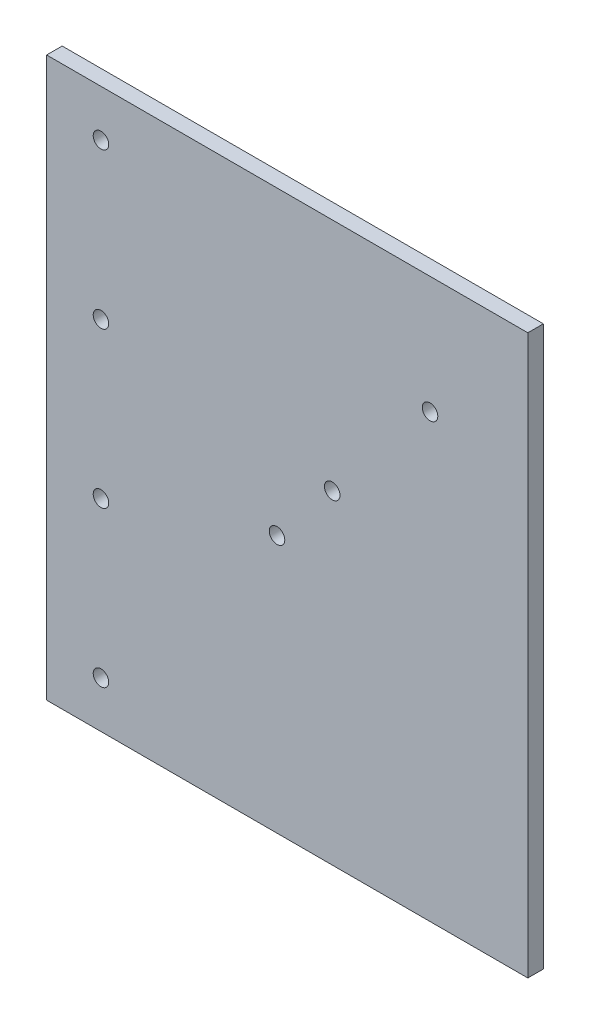
ISO-10303-21;
HEADER;
FILE_DESCRIPTION(('STEP AP214'),'2;1');
FILE_NAME('part.step','',(''),(''),'','','');
FILE_SCHEMA(('AUTOMOTIVE_DESIGN { 1 0 10303 214 1 1 1 1 }'));
ENDSEC;
DATA;
#1=APPLICATION_CONTEXT('core data for automotive mechanical design processes');
#2=APPLICATION_PROTOCOL_DEFINITION('international standard','automotive_design',2000,#1);
#3=PRODUCT_CONTEXT('',#1,'mechanical');
#4=PRODUCT('Part','Part','',(#3));
#5=PRODUCT_RELATED_PRODUCT_CATEGORY('part','',(#4));
#6=PRODUCT_DEFINITION_FORMATION('','',#4);
#7=PRODUCT_DEFINITION_CONTEXT('part definition',#1,'design');
#8=PRODUCT_DEFINITION('design','',#6,#7);
#9=PRODUCT_DEFINITION_SHAPE('','',#8);
#10=(LENGTH_UNIT() NAMED_UNIT(*) SI_UNIT(.MILLI.,.METRE.));
#11=(NAMED_UNIT(*) PLANE_ANGLE_UNIT() SI_UNIT($,.RADIAN.));
#12=(NAMED_UNIT(*) SI_UNIT($,.STERADIAN.) SOLID_ANGLE_UNIT());
#13=UNCERTAINTY_MEASURE_WITH_UNIT(LENGTH_MEASURE(1.E-05),#10,'distance_accuracy_value','');
#14=(GEOMETRIC_REPRESENTATION_CONTEXT(3) GLOBAL_UNCERTAINTY_ASSIGNED_CONTEXT((#13)) GLOBAL_UNIT_ASSIGNED_CONTEXT((#10,
#11,#12)) REPRESENTATION_CONTEXT('',''));
#15=CARTESIAN_POINT('',(0.,0.,0.));
#16=DIRECTION('',(0.,0.,1.));
#17=DIRECTION('',(1.,0.,0.));
#18=AXIS2_PLACEMENT_3D('',#15,#16,#17);
#19=CARTESIAN_POINT('',(0.,0.,12.7));
#20=DIRECTION('',(1.,0.,0.));
#21=DIRECTION('',(0.,0.,-1.));
#22=AXIS2_PLACEMENT_3D('',#19,#20,#21);
#23=PLANE('',#22);
#24=DIRECTION('',(0.,-1.,0.));
#25=VECTOR('',#24,1.);
#26=CARTESIAN_POINT('',(0.,0.,0.));
#27=LINE('',#26,#25);
#28=CARTESIAN_POINT('',(0.,457.2,0.));
#29=VERTEX_POINT('',#28);
#30=CARTESIAN_POINT('',(0.,0.,0.));
#31=VERTEX_POINT('',#30);
#32=EDGE_CURVE('E117',#29,#31,#27,.T.);
#33=ORIENTED_EDGE('',*,*,#32,.T.);
#34=DIRECTION('',(0.,0.,-1.));
#35=VECTOR('',#34,1.);
#36=CARTESIAN_POINT('',(0.,0.,12.7));
#37=LINE('',#36,#35);
#38=CARTESIAN_POINT('',(0.,0.,12.7));
#39=VERTEX_POINT('',#38);
#40=EDGE_CURVE('E106',#39,#31,#37,.T.);
#41=ORIENTED_EDGE('',*,*,#40,.F.);
#42=DIRECTION('',(0.,-1.,0.));
#43=VECTOR('',#42,1.);
#44=CARTESIAN_POINT('',(0.,0.,12.7));
#45=LINE('',#44,#43);
#46=CARTESIAN_POINT('',(0.,457.2,12.7));
#47=VERTEX_POINT('',#46);
#48=EDGE_CURVE('E98',#47,#39,#45,.T.);
#49=ORIENTED_EDGE('',*,*,#48,.F.);
#50=DIRECTION('',(0.,0.,-1.));
#51=VECTOR('',#50,1.);
#52=CARTESIAN_POINT('',(0.,457.2,12.7));
#53=LINE('',#52,#51);
#54=EDGE_CURVE('E113',#47,#29,#53,.T.);
#55=ORIENTED_EDGE('',*,*,#54,.T.);
#56=EDGE_LOOP('',(#33,#41,#49,#55));
#57=FACE_BOUND('',#56,.T.);
#58=ADVANCED_FACE('F41',(#57),#23,.F.);
#59=CARTESIAN_POINT('',(0.,0.,12.7));
#60=DIRECTION('',(0.,1.,0.));
#61=DIRECTION('',(0.,0.,1.));
#62=AXIS2_PLACEMENT_3D('',#59,#60,#61);
#63=PLANE('',#62);
#64=DIRECTION('',(1.,0.,0.));
#65=VECTOR('',#64,1.);
#66=CARTESIAN_POINT('',(0.,0.,0.));
#67=LINE('',#66,#65);
#68=CARTESIAN_POINT('',(393.7,0.,0.));
#69=VERTEX_POINT('',#68);
#70=EDGE_CURVE('E104',#31,#69,#67,.T.);
#71=ORIENTED_EDGE('',*,*,#70,.T.);
#72=DIRECTION('',(0.,0.,-1.));
#73=VECTOR('',#72,1.);
#74=CARTESIAN_POINT('',(393.7,0.,12.7));
#75=LINE('',#74,#73);
#76=CARTESIAN_POINT('',(393.7,0.,12.7));
#77=VERTEX_POINT('',#76);
#78=EDGE_CURVE('E102',#77,#69,#75,.T.);
#79=ORIENTED_EDGE('',*,*,#78,.F.);
#80=DIRECTION('',(1.,0.,0.));
#81=VECTOR('',#80,1.);
#82=CARTESIAN_POINT('',(0.,0.,12.7));
#83=LINE('',#82,#81);
#84=EDGE_CURVE('E92',#39,#77,#83,.T.);
#85=ORIENTED_EDGE('',*,*,#84,.F.);
#86=ORIENTED_EDGE('',*,*,#40,.T.);
#87=EDGE_LOOP('',(#71,#79,#85,#86));
#88=FACE_BOUND('',#87,.T.);
#89=ADVANCED_FACE('F103',(#88),#63,.F.);
#90=CARTESIAN_POINT('',(393.7,0.,12.7));
#91=DIRECTION('',(-1.,0.,0.));
#92=DIRECTION('',(0.,0.,1.));
#93=AXIS2_PLACEMENT_3D('',#90,#91,#92);
#94=PLANE('',#93);
#95=DIRECTION('',(0.,1.,0.));
#96=VECTOR('',#95,1.);
#97=CARTESIAN_POINT('',(393.7,0.,0.));
#98=LINE('',#97,#96);
#99=CARTESIAN_POINT('',(393.7,457.2,0.));
#100=VERTEX_POINT('',#99);
#101=EDGE_CURVE('E78',#69,#100,#98,.T.);
#102=ORIENTED_EDGE('',*,*,#101,.T.);
#103=DIRECTION('',(0.,0.,-1.));
#104=VECTOR('',#103,1.);
#105=CARTESIAN_POINT('',(393.7,457.2,12.7));
#106=LINE('',#105,#104);
#107=CARTESIAN_POINT('',(393.7,457.2,12.7));
#108=VERTEX_POINT('',#107);
#109=EDGE_CURVE('E107',#108,#100,#106,.T.);
#110=ORIENTED_EDGE('',*,*,#109,.F.);
#111=DIRECTION('',(0.,1.,0.));
#112=VECTOR('',#111,1.);
#113=CARTESIAN_POINT('',(393.7,0.,12.7));
#114=LINE('',#113,#112);
#115=EDGE_CURVE('E96',#77,#108,#114,.T.);
#116=ORIENTED_EDGE('',*,*,#115,.F.);
#117=ORIENTED_EDGE('',*,*,#78,.T.);
#118=EDGE_LOOP('',(#102,#110,#116,#117));
#119=FACE_BOUND('',#118,.T.);
#120=ADVANCED_FACE('F109',(#119),#94,.F.);
#121=CARTESIAN_POINT('',(0.,457.2,12.7));
#122=DIRECTION('',(0.,-1.,0.));
#123=DIRECTION('',(0.,0.,-1.));
#124=AXIS2_PLACEMENT_3D('',#121,#122,#123);
#125=PLANE('',#124);
#126=DIRECTION('',(-1.,0.,0.));
#127=VECTOR('',#126,1.);
#128=CARTESIAN_POINT('',(0.,457.2,0.));
#129=LINE('',#128,#127);
#130=EDGE_CURVE('E84',#100,#29,#129,.T.);
#131=ORIENTED_EDGE('',*,*,#130,.T.);
#132=ORIENTED_EDGE('',*,*,#54,.F.);
#133=DIRECTION('',(-1.,0.,0.));
#134=VECTOR('',#133,1.);
#135=CARTESIAN_POINT('',(0.,457.2,12.7));
#136=LINE('',#135,#134);
#137=EDGE_CURVE('E61',#108,#47,#136,.T.);
#138=ORIENTED_EDGE('',*,*,#137,.F.);
#139=ORIENTED_EDGE('',*,*,#109,.T.);
#140=EDGE_LOOP('',(#131,#132,#138,#139));
#141=FACE_BOUND('',#140,.T.);
#142=ADVANCED_FACE('F189',(#141),#125,.F.);
#143=CARTESIAN_POINT('',(0.,457.2,12.7));
#144=DIRECTION('',(0.,0.,-1.));
#145=DIRECTION('',(-1.,0.,0.));
#146=AXIS2_PLACEMENT_3D('',#143,#144,#145);
#147=PLANE('',#146);
#148=CARTESIAN_POINT('',(188.491489924508,210.94978790941,12.7));
#149=DIRECTION('',(0.,0.,1.));
#150=DIRECTION('',(1.,0.,0.));
#151=AXIS2_PLACEMENT_3D('',#148,#149,#150);
#152=CIRCLE('',#151,6.34999999999999);
#153=CARTESIAN_POINT('',(194.841489924508,210.94978790941,12.7));
#154=VERTEX_POINT('',#153);
#155=EDGE_CURVE('E170',#154,#154,#152,.T.);
#156=ORIENTED_EDGE('',*,*,#155,.F.);
#157=EDGE_LOOP('',(#156));
#158=FACE_BOUND('',#157,.T.);
#159=CARTESIAN_POINT('',(313.67695004194,361.172340050328,12.7));
#160=DIRECTION('',(0.,0.,1.));
#161=DIRECTION('',(1.,0.,0.));
#162=AXIS2_PLACEMENT_3D('',#159,#160,#161);
#163=CIRCLE('',#162,6.35000000000002);
#164=CARTESIAN_POINT('',(320.02695004194,361.172340050328,12.7));
#165=VERTEX_POINT('',#164);
#166=EDGE_CURVE('E157',#165,#165,#163,.T.);
#167=ORIENTED_EDGE('',*,*,#166,.F.);
#168=EDGE_LOOP('',(#167));
#169=FACE_BOUND('',#168,.T.);
#170=CARTESIAN_POINT('',(233.65390008388,265.144680100656,12.7));
#171=DIRECTION('',(0.,0.,1.));
#172=DIRECTION('',(1.,0.,0.));
#173=AXIS2_PLACEMENT_3D('',#170,#171,#172);
#174=CIRCLE('',#173,6.34999999999999);
#175=CARTESIAN_POINT('',(240.00390008388,265.144680100656,12.7));
#176=VERTEX_POINT('',#175);
#177=EDGE_CURVE('E153',#176,#176,#174,.T.);
#178=ORIENTED_EDGE('',*,*,#177,.F.);
#179=EDGE_LOOP('',(#178));
#180=FACE_BOUND('',#179,.T.);
#181=CARTESIAN_POINT('',(44.45,165.1,12.7));
#182=DIRECTION('',(0.,0.,1.));
#183=DIRECTION('',(1.,0.,0.));
#184=AXIS2_PLACEMENT_3D('',#181,#182,#183);
#185=CIRCLE('',#184,6.34999999999999);
#186=CARTESIAN_POINT('',(50.8,165.1,12.7));
#187=VERTEX_POINT('',#186);
#188=EDGE_CURVE('E176',#187,#187,#185,.T.);
#189=ORIENTED_EDGE('',*,*,#188,.F.);
#190=EDGE_LOOP('',(#189));
#191=FACE_BOUND('',#190,.T.);
#192=CARTESIAN_POINT('',(44.45,38.1,12.7));
#193=DIRECTION('',(0.,0.,1.));
#194=DIRECTION('',(1.,0.,0.));
#195=AXIS2_PLACEMENT_3D('',#192,#193,#194);
#196=CIRCLE('',#195,6.34999999999999);
#197=CARTESIAN_POINT('',(50.8,38.1,12.7));
#198=VERTEX_POINT('',#197);
#199=EDGE_CURVE('E138',#198,#198,#196,.T.);
#200=ORIENTED_EDGE('',*,*,#199,.F.);
#201=EDGE_LOOP('',(#200));
#202=FACE_BOUND('',#201,.T.);
#203=ORIENTED_EDGE('',*,*,#48,.T.);
#204=ORIENTED_EDGE('',*,*,#84,.T.);
#205=ORIENTED_EDGE('',*,*,#115,.T.);
#206=ORIENTED_EDGE('',*,*,#137,.T.);
#207=EDGE_LOOP('',(#203,#204,#205,#206));
#208=FACE_BOUND('',#207,.T.);
#209=CARTESIAN_POINT('',(44.45,292.1,12.7));
#210=DIRECTION('',(0.,0.,1.));
#211=DIRECTION('',(1.,0.,0.));
#212=AXIS2_PLACEMENT_3D('',#209,#210,#211);
#213=CIRCLE('',#212,6.34999999999999);
#214=CARTESIAN_POINT('',(50.8,292.1,12.7));
#215=VERTEX_POINT('',#214);
#216=EDGE_CURVE('E142',#215,#215,#213,.T.);
#217=ORIENTED_EDGE('',*,*,#216,.F.);
#218=EDGE_LOOP('',(#217));
#219=FACE_BOUND('',#218,.T.);
#220=CARTESIAN_POINT('',(44.45,419.1,12.7));
#221=DIRECTION('',(0.,0.,1.));
#222=DIRECTION('',(1.,0.,0.));
#223=AXIS2_PLACEMENT_3D('',#220,#221,#222);
#224=CIRCLE('',#223,6.34999999999999);
#225=CARTESIAN_POINT('',(50.8,419.1,12.7));
#226=VERTEX_POINT('',#225);
#227=EDGE_CURVE('E11',#226,#226,#224,.T.);
#228=ORIENTED_EDGE('',*,*,#227,.F.);
#229=EDGE_LOOP('',(#228));
#230=FACE_BOUND('',#229,.T.);
#231=ADVANCED_FACE('F93',(#158,#169,#180,#191,#202,#208,#219,#230),#147,.F.);
#232=CARTESIAN_POINT('',(0.,457.2,0.));
#233=DIRECTION('',(0.,0.,-1.));
#234=DIRECTION('',(-1.,0.,0.));
#235=AXIS2_PLACEMENT_3D('',#232,#233,#234);
#236=PLANE('',#235);
#237=CARTESIAN_POINT('',(188.491489924508,210.94978790941,0.));
#238=DIRECTION('',(0.,0.,-1.));
#239=DIRECTION('',(-1.,0.,0.));
#240=AXIS2_PLACEMENT_3D('',#237,#238,#239);
#241=CIRCLE('',#240,6.34999999999999);
#242=CARTESIAN_POINT('',(182.141489924508,210.94978790941,0.));
#243=VERTEX_POINT('',#242);
#244=EDGE_CURVE('E45',#243,#243,#241,.T.);
#245=ORIENTED_EDGE('',*,*,#244,.F.);
#246=EDGE_LOOP('',(#245));
#247=FACE_BOUND('',#246,.T.);
#248=CARTESIAN_POINT('',(313.67695004194,361.172340050328,0.));
#249=DIRECTION('',(0.,0.,-1.));
#250=DIRECTION('',(-1.,0.,0.));
#251=AXIS2_PLACEMENT_3D('',#248,#249,#250);
#252=CIRCLE('',#251,6.34999999999999);
#253=CARTESIAN_POINT('',(307.32695004194,361.172340050328,0.));
#254=VERTEX_POINT('',#253);
#255=EDGE_CURVE('E154',#254,#254,#252,.T.);
#256=ORIENTED_EDGE('',*,*,#255,.F.);
#257=EDGE_LOOP('',(#256));
#258=FACE_BOUND('',#257,.T.);
#259=CARTESIAN_POINT('',(233.65390008388,265.144680100656,0.));
#260=DIRECTION('',(0.,0.,-1.));
#261=DIRECTION('',(-1.,0.,0.));
#262=AXIS2_PLACEMENT_3D('',#259,#260,#261);
#263=CIRCLE('',#262,6.34999999999999);
#264=CARTESIAN_POINT('',(227.30390008388,265.144680100656,0.));
#265=VERTEX_POINT('',#264);
#266=EDGE_CURVE('E149',#265,#265,#263,.T.);
#267=ORIENTED_EDGE('',*,*,#266,.F.);
#268=EDGE_LOOP('',(#267));
#269=FACE_BOUND('',#268,.T.);
#270=CARTESIAN_POINT('',(44.45,165.1,0.));
#271=DIRECTION('',(0.,0.,-1.));
#272=DIRECTION('',(-1.,0.,0.));
#273=AXIS2_PLACEMENT_3D('',#270,#271,#272);
#274=CIRCLE('',#273,6.34999999999999);
#275=CARTESIAN_POINT('',(38.1,165.1,0.));
#276=VERTEX_POINT('',#275);
#277=EDGE_CURVE('E152',#276,#276,#274,.T.);
#278=ORIENTED_EDGE('',*,*,#277,.F.);
#279=EDGE_LOOP('',(#278));
#280=FACE_BOUND('',#279,.T.);
#281=CARTESIAN_POINT('',(44.45,38.1,0.));
#282=DIRECTION('',(0.,0.,-1.));
#283=DIRECTION('',(-1.,0.,0.));
#284=AXIS2_PLACEMENT_3D('',#281,#282,#283);
#285=CIRCLE('',#284,6.34999999999999);
#286=CARTESIAN_POINT('',(38.1,38.1,0.));
#287=VERTEX_POINT('',#286);
#288=EDGE_CURVE('E121',#287,#287,#285,.T.);
#289=ORIENTED_EDGE('',*,*,#288,.F.);
#290=EDGE_LOOP('',(#289));
#291=FACE_BOUND('',#290,.T.);
#292=ORIENTED_EDGE('',*,*,#32,.F.);
#293=ORIENTED_EDGE('',*,*,#130,.F.);
#294=ORIENTED_EDGE('',*,*,#101,.F.);
#295=ORIENTED_EDGE('',*,*,#70,.F.);
#296=EDGE_LOOP('',(#292,#293,#294,#295));
#297=FACE_BOUND('',#296,.T.);
#298=CARTESIAN_POINT('',(44.45,292.1,0.));
#299=DIRECTION('',(0.,0.,-1.));
#300=DIRECTION('',(-1.,0.,0.));
#301=AXIS2_PLACEMENT_3D('',#298,#299,#300);
#302=CIRCLE('',#301,6.34999999999999);
#303=CARTESIAN_POINT('',(38.1,292.1,0.));
#304=VERTEX_POINT('',#303);
#305=EDGE_CURVE('E134',#304,#304,#302,.T.);
#306=ORIENTED_EDGE('',*,*,#305,.F.);
#307=EDGE_LOOP('',(#306));
#308=FACE_BOUND('',#307,.T.);
#309=CARTESIAN_POINT('',(44.45,419.1,0.));
#310=DIRECTION('',(0.,0.,-1.));
#311=DIRECTION('',(-1.,0.,0.));
#312=AXIS2_PLACEMENT_3D('',#309,#310,#311);
#313=CIRCLE('',#312,6.34999999999999);
#314=CARTESIAN_POINT('',(38.1,419.1,0.));
#315=VERTEX_POINT('',#314);
#316=EDGE_CURVE('E52',#315,#315,#313,.T.);
#317=ORIENTED_EDGE('',*,*,#316,.F.);
#318=EDGE_LOOP('',(#317));
#319=FACE_BOUND('',#318,.T.);
#320=ADVANCED_FACE('F188',(#247,#258,#269,#280,#291,#297,#308,#319),#236,.T.);
#321=CARTESIAN_POINT('',(44.45,38.1,12.7));
#322=DIRECTION('',(0.,0.,1.));
#323=DIRECTION('',(1.,0.,0.));
#324=AXIS2_PLACEMENT_3D('',#321,#322,#323);
#325=CYLINDRICAL_SURFACE('',#324,6.34999999999999);
#326=ORIENTED_EDGE('',*,*,#288,.T.);
#327=EDGE_LOOP('',(#326));
#328=FACE_BOUND('',#327,.T.);
#329=ORIENTED_EDGE('',*,*,#199,.T.);
#330=EDGE_LOOP('',(#329));
#331=FACE_BOUND('',#330,.T.);
#332=ADVANCED_FACE('F185',(#328,#331),#325,.F.);
#333=CARTESIAN_POINT('',(44.45,165.1,12.7));
#334=DIRECTION('',(0.,0.,1.));
#335=DIRECTION('',(1.,0.,0.));
#336=AXIS2_PLACEMENT_3D('',#333,#334,#335);
#337=CYLINDRICAL_SURFACE('',#336,6.34999999999999);
#338=ORIENTED_EDGE('',*,*,#277,.T.);
#339=EDGE_LOOP('',(#338));
#340=FACE_BOUND('',#339,.T.);
#341=ORIENTED_EDGE('',*,*,#188,.T.);
#342=EDGE_LOOP('',(#341));
#343=FACE_BOUND('',#342,.T.);
#344=ADVANCED_FACE('F213',(#340,#343),#337,.F.);
#345=CARTESIAN_POINT('',(44.45,292.1,12.7));
#346=DIRECTION('',(0.,0.,1.));
#347=DIRECTION('',(1.,0.,0.));
#348=AXIS2_PLACEMENT_3D('',#345,#346,#347);
#349=CYLINDRICAL_SURFACE('',#348,6.34999999999999);
#350=ORIENTED_EDGE('',*,*,#305,.T.);
#351=EDGE_LOOP('',(#350));
#352=FACE_BOUND('',#351,.T.);
#353=ORIENTED_EDGE('',*,*,#216,.T.);
#354=EDGE_LOOP('',(#353));
#355=FACE_BOUND('',#354,.T.);
#356=ADVANCED_FACE('F211',(#352,#355),#349,.F.);
#357=CARTESIAN_POINT('',(44.45,419.1,12.7));
#358=DIRECTION('',(0.,0.,1.));
#359=DIRECTION('',(1.,0.,0.));
#360=AXIS2_PLACEMENT_3D('',#357,#358,#359);
#361=CYLINDRICAL_SURFACE('',#360,6.34999999999999);
#362=ORIENTED_EDGE('',*,*,#316,.T.);
#363=EDGE_LOOP('',(#362));
#364=FACE_BOUND('',#363,.T.);
#365=ORIENTED_EDGE('',*,*,#227,.T.);
#366=EDGE_LOOP('',(#365));
#367=FACE_BOUND('',#366,.T.);
#368=ADVANCED_FACE('F43',(#364,#367),#361,.F.);
#369=CARTESIAN_POINT('',(233.65390008388,265.144680100656,12.7));
#370=DIRECTION('',(0.,0.,1.));
#371=DIRECTION('',(1.,0.,0.));
#372=AXIS2_PLACEMENT_3D('',#369,#370,#371);
#373=CYLINDRICAL_SURFACE('',#372,6.34999999999999);
#374=ORIENTED_EDGE('',*,*,#266,.T.);
#375=EDGE_LOOP('',(#374));
#376=FACE_BOUND('',#375,.T.);
#377=ORIENTED_EDGE('',*,*,#177,.T.);
#378=EDGE_LOOP('',(#377));
#379=FACE_BOUND('',#378,.T.);
#380=ADVANCED_FACE('F219',(#376,#379),#373,.F.);
#381=CARTESIAN_POINT('',(313.67695004194,361.172340050328,12.7));
#382=DIRECTION('',(0.,0.,1.));
#383=DIRECTION('',(1.,0.,0.));
#384=AXIS2_PLACEMENT_3D('',#381,#382,#383);
#385=CYLINDRICAL_SURFACE('',#384,6.34999999999999);
#386=ORIENTED_EDGE('',*,*,#255,.T.);
#387=EDGE_LOOP('',(#386));
#388=FACE_BOUND('',#387,.T.);
#389=ORIENTED_EDGE('',*,*,#166,.T.);
#390=EDGE_LOOP('',(#389));
#391=FACE_BOUND('',#390,.T.);
#392=ADVANCED_FACE('F240',(#388,#391),#385,.F.);
#393=CARTESIAN_POINT('',(188.491489924508,210.94978790941,12.7));
#394=DIRECTION('',(0.,0.,1.));
#395=DIRECTION('',(1.,0.,0.));
#396=AXIS2_PLACEMENT_3D('',#393,#394,#395);
#397=CYLINDRICAL_SURFACE('',#396,6.34999999999999);
#398=ORIENTED_EDGE('',*,*,#244,.T.);
#399=EDGE_LOOP('',(#398));
#400=FACE_BOUND('',#399,.T.);
#401=ORIENTED_EDGE('',*,*,#155,.T.);
#402=EDGE_LOOP('',(#401));
#403=FACE_BOUND('',#402,.T.);
#404=ADVANCED_FACE('F244',(#400,#403),#397,.F.);
#405=CLOSED_SHELL('',(#58,#89,#120,#142,#231,#320,#332,#344,#356,#368,#380,#392,#404));
#406=MANIFOLD_SOLID_BREP('B2',#405);
#407=ADVANCED_BREP_SHAPE_REPRESENTATION('',(#18,#406),#14);
#408=SHAPE_DEFINITION_REPRESENTATION(#9,#407);
ENDSEC;
END-ISO-10303-21;
